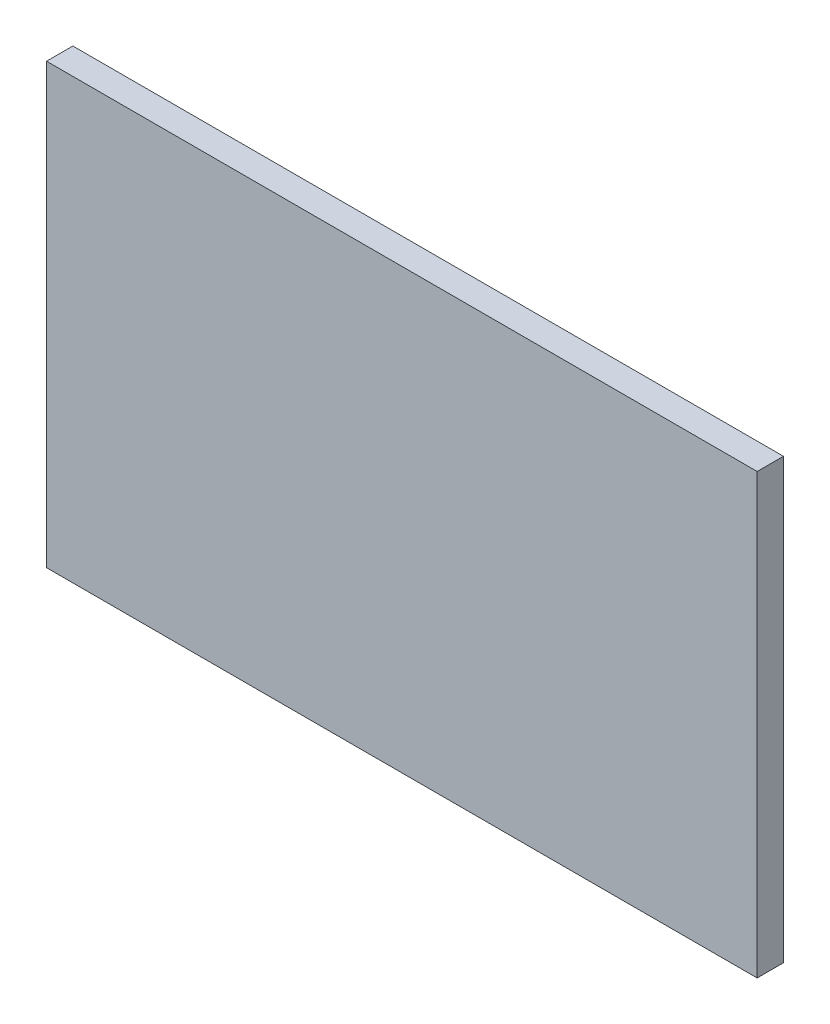
ISO-10303-21;
HEADER;
FILE_DESCRIPTION(('STEP AP214'),'2;1');
FILE_NAME('part.step','',(''),(''),'','','');
FILE_SCHEMA(('AUTOMOTIVE_DESIGN { 1 0 10303 214 1 1 1 1 }'));
ENDSEC;
DATA;
#1=APPLICATION_CONTEXT('core data for automotive mechanical design processes');
#2=APPLICATION_PROTOCOL_DEFINITION('international standard','automotive_design',2000,#1);
#3=PRODUCT_CONTEXT('',#1,'mechanical');
#4=PRODUCT('Part','Part','',(#3));
#5=PRODUCT_RELATED_PRODUCT_CATEGORY('part','',(#4));
#6=PRODUCT_DEFINITION_FORMATION('','',#4);
#7=PRODUCT_DEFINITION_CONTEXT('part definition',#1,'design');
#8=PRODUCT_DEFINITION('design','',#6,#7);
#9=PRODUCT_DEFINITION_SHAPE('','',#8);
#10=(LENGTH_UNIT() NAMED_UNIT(*) SI_UNIT(.MILLI.,.METRE.));
#11=(NAMED_UNIT(*) PLANE_ANGLE_UNIT() SI_UNIT($,.RADIAN.));
#12=(NAMED_UNIT(*) SI_UNIT($,.STERADIAN.) SOLID_ANGLE_UNIT());
#13=UNCERTAINTY_MEASURE_WITH_UNIT(LENGTH_MEASURE(1.E-05),#10,'distance_accuracy_value','');
#14=(GEOMETRIC_REPRESENTATION_CONTEXT(3) GLOBAL_UNCERTAINTY_ASSIGNED_CONTEXT((#13)) GLOBAL_UNIT_ASSIGNED_CONTEXT((#10,
#11,#12)) REPRESENTATION_CONTEXT('',''));
#15=CARTESIAN_POINT('',(0.,0.,0.));
#16=DIRECTION('',(0.,0.,1.));
#17=DIRECTION('',(1.,0.,0.));
#18=AXIS2_PLACEMENT_3D('',#15,#16,#17);
#19=CARTESIAN_POINT('',(-1.,-16.,1.));
#20=DIRECTION('',(1.,0.,0.));
#21=DIRECTION('',(0.,0.,-1.));
#22=AXIS2_PLACEMENT_3D('',#19,#20,#21);
#23=PLANE('',#22);
#24=DIRECTION('',(0.,-1.,0.));
#25=VECTOR('',#24,1.);
#26=CARTESIAN_POINT('',(-1.,-16.,0.));
#27=LINE('',#26,#25);
#28=CARTESIAN_POINT('',(-1.,0.667363,0.));
#29=VERTEX_POINT('',#28);
#30=CARTESIAN_POINT('',(-1.,-16.,0.));
#31=VERTEX_POINT('',#30);
#32=EDGE_CURVE('E99',#29,#31,#27,.T.);
#33=ORIENTED_EDGE('',*,*,#32,.T.);
#34=DIRECTION('',(0.,0.,-1.));
#35=VECTOR('',#34,1.);
#36=CARTESIAN_POINT('',(-1.,-16.,1.));
#37=LINE('',#36,#35);
#38=CARTESIAN_POINT('',(-1.,-16.,1.));
#39=VERTEX_POINT('',#38);
#40=EDGE_CURVE('E11',#39,#31,#37,.T.);
#41=ORIENTED_EDGE('',*,*,#40,.F.);
#42=DIRECTION('',(0.,-1.,0.));
#43=VECTOR('',#42,1.);
#44=CARTESIAN_POINT('',(-1.,-16.,1.));
#45=LINE('',#44,#43);
#46=CARTESIAN_POINT('',(-1.,0.667363,1.));
#47=VERTEX_POINT('',#46);
#48=EDGE_CURVE('E87',#47,#39,#45,.T.);
#49=ORIENTED_EDGE('',*,*,#48,.F.);
#50=DIRECTION('',(0.,0.,-1.));
#51=VECTOR('',#50,1.);
#52=CARTESIAN_POINT('',(-1.,0.667363,1.));
#53=LINE('',#52,#51);
#54=EDGE_CURVE('E95',#47,#29,#53,.T.);
#55=ORIENTED_EDGE('',*,*,#54,.T.);
#56=EDGE_LOOP('',(#33,#41,#49,#55));
#57=FACE_BOUND('',#56,.T.);
#58=ADVANCED_FACE('F36',(#57),#23,.F.);
#59=CARTESIAN_POINT('',(26.,-16.,1.));
#60=DIRECTION('',(0.,1.,0.));
#61=DIRECTION('',(0.,0.,1.));
#62=AXIS2_PLACEMENT_3D('',#59,#60,#61);
#63=PLANE('',#62);
#64=DIRECTION('',(1.,0.,0.));
#65=VECTOR('',#64,1.);
#66=CARTESIAN_POINT('',(26.,-16.,0.));
#67=LINE('',#66,#65);
#68=CARTESIAN_POINT('',(26.,-16.,0.));
#69=VERTEX_POINT('',#68);
#70=EDGE_CURVE('E91',#31,#69,#67,.T.);
#71=ORIENTED_EDGE('',*,*,#70,.T.);
#72=DIRECTION('',(0.,0.,-1.));
#73=VECTOR('',#72,1.);
#74=CARTESIAN_POINT('',(26.,-16.,1.));
#75=LINE('',#74,#73);
#76=CARTESIAN_POINT('',(26.,-16.,1.));
#77=VERTEX_POINT('',#76);
#78=EDGE_CURVE('E44',#77,#69,#75,.T.);
#79=ORIENTED_EDGE('',*,*,#78,.F.);
#80=DIRECTION('',(1.,0.,0.));
#81=VECTOR('',#80,1.);
#82=CARTESIAN_POINT('',(26.,-16.,1.));
#83=LINE('',#82,#81);
#84=EDGE_CURVE('E82',#39,#77,#83,.T.);
#85=ORIENTED_EDGE('',*,*,#84,.F.);
#86=ORIENTED_EDGE('',*,*,#40,.T.);
#87=EDGE_LOOP('',(#71,#79,#85,#86));
#88=FACE_BOUND('',#87,.T.);
#89=ADVANCED_FACE('F90',(#88),#63,.F.);
#90=CARTESIAN_POINT('',(26.,0.667363,1.));
#91=DIRECTION('',(-1.,0.,0.));
#92=DIRECTION('',(0.,0.,1.));
#93=AXIS2_PLACEMENT_3D('',#90,#91,#92);
#94=PLANE('',#93);
#95=DIRECTION('',(0.,1.,0.));
#96=VECTOR('',#95,1.);
#97=CARTESIAN_POINT('',(26.,0.667363,0.));
#98=LINE('',#97,#96);
#99=CARTESIAN_POINT('',(26.,0.667363,0.));
#100=VERTEX_POINT('',#99);
#101=EDGE_CURVE('E69',#69,#100,#98,.T.);
#102=ORIENTED_EDGE('',*,*,#101,.T.);
#103=DIRECTION('',(0.,0.,-1.));
#104=VECTOR('',#103,1.);
#105=CARTESIAN_POINT('',(26.,0.667363,1.));
#106=LINE('',#105,#104);
#107=CARTESIAN_POINT('',(26.,0.667363,1.));
#108=VERTEX_POINT('',#107);
#109=EDGE_CURVE('E92',#108,#100,#106,.T.);
#110=ORIENTED_EDGE('',*,*,#109,.F.);
#111=DIRECTION('',(0.,1.,0.));
#112=VECTOR('',#111,1.);
#113=CARTESIAN_POINT('',(26.,0.667363,1.));
#114=LINE('',#113,#112);
#115=EDGE_CURVE('E85',#77,#108,#114,.T.);
#116=ORIENTED_EDGE('',*,*,#115,.F.);
#117=ORIENTED_EDGE('',*,*,#78,.T.);
#118=EDGE_LOOP('',(#102,#110,#116,#117));
#119=FACE_BOUND('',#118,.T.);
#120=ADVANCED_FACE('F93',(#119),#94,.F.);
#121=CARTESIAN_POINT('',(-1.,0.667363,1.));
#122=DIRECTION('',(0.,-1.,0.));
#123=DIRECTION('',(0.,0.,-1.));
#124=AXIS2_PLACEMENT_3D('',#121,#122,#123);
#125=PLANE('',#124);
#126=DIRECTION('',(-1.,0.,0.));
#127=VECTOR('',#126,1.);
#128=CARTESIAN_POINT('',(-1.,0.667363,0.));
#129=LINE('',#128,#127);
#130=EDGE_CURVE('E75',#100,#29,#129,.T.);
#131=ORIENTED_EDGE('',*,*,#130,.T.);
#132=ORIENTED_EDGE('',*,*,#54,.F.);
#133=DIRECTION('',(-1.,0.,0.));
#134=VECTOR('',#133,1.);
#135=CARTESIAN_POINT('',(-1.,0.667363,1.));
#136=LINE('',#135,#134);
#137=EDGE_CURVE('E52',#108,#47,#136,.T.);
#138=ORIENTED_EDGE('',*,*,#137,.F.);
#139=ORIENTED_EDGE('',*,*,#109,.T.);
#140=EDGE_LOOP('',(#131,#132,#138,#139));
#141=FACE_BOUND('',#140,.T.);
#142=ADVANCED_FACE('F106',(#141),#125,.F.);
#143=CARTESIAN_POINT('',(0.,0.,1.));
#144=DIRECTION('',(0.,0.,-1.));
#145=DIRECTION('',(-1.,0.,0.));
#146=AXIS2_PLACEMENT_3D('',#143,#144,#145);
#147=PLANE('',#146);
#148=ORIENTED_EDGE('',*,*,#48,.T.);
#149=ORIENTED_EDGE('',*,*,#84,.T.);
#150=ORIENTED_EDGE('',*,*,#115,.T.);
#151=ORIENTED_EDGE('',*,*,#137,.T.);
#152=EDGE_LOOP('',(#148,#149,#150,#151));
#153=FACE_BOUND('',#152,.T.);
#154=ADVANCED_FACE('F83',(#153),#147,.F.);
#155=CARTESIAN_POINT('',(0.,0.,0.));
#156=DIRECTION('',(0.,0.,-1.));
#157=DIRECTION('',(-1.,0.,0.));
#158=AXIS2_PLACEMENT_3D('',#155,#156,#157);
#159=PLANE('',#158);
#160=ORIENTED_EDGE('',*,*,#32,.F.);
#161=ORIENTED_EDGE('',*,*,#130,.F.);
#162=ORIENTED_EDGE('',*,*,#101,.F.);
#163=ORIENTED_EDGE('',*,*,#70,.F.);
#164=EDGE_LOOP('',(#160,#161,#162,#163));
#165=FACE_BOUND('',#164,.T.);
#166=ADVANCED_FACE('F109',(#165),#159,.T.);
#167=CLOSED_SHELL('',(#58,#89,#120,#142,#154,#166));
#168=MANIFOLD_SOLID_BREP('B2',#167);
#169=ADVANCED_BREP_SHAPE_REPRESENTATION('',(#18,#168),#14);
#170=SHAPE_DEFINITION_REPRESENTATION(#9,#169);
ENDSEC;
END-ISO-10303-21;
